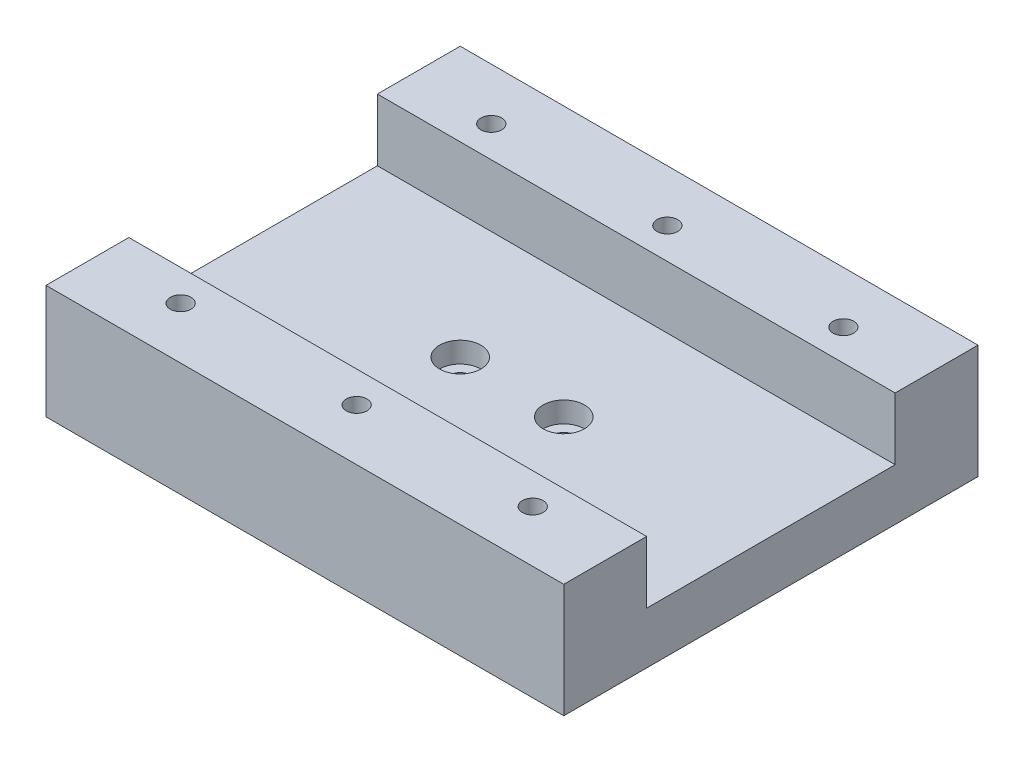
ISO-10303-21;
HEADER;
FILE_DESCRIPTION(('STEP AP214'),'2;1');
FILE_NAME('part.step','',(''),(''),'','','');
FILE_SCHEMA(('AUTOMOTIVE_DESIGN { 1 0 10303 214 1 1 1 1 }'));
ENDSEC;
DATA;
#1=APPLICATION_CONTEXT('core data for automotive mechanical design processes');
#2=APPLICATION_PROTOCOL_DEFINITION('international standard','automotive_design',2000,#1);
#3=PRODUCT_CONTEXT('',#1,'mechanical');
#4=PRODUCT('Part','Part','',(#3));
#5=PRODUCT_RELATED_PRODUCT_CATEGORY('part','',(#4));
#6=PRODUCT_DEFINITION_FORMATION('','',#4);
#7=PRODUCT_DEFINITION_CONTEXT('part definition',#1,'design');
#8=PRODUCT_DEFINITION('design','',#6,#7);
#9=PRODUCT_DEFINITION_SHAPE('','',#8);
#10=(LENGTH_UNIT() NAMED_UNIT(*) SI_UNIT(.MILLI.,.METRE.));
#11=(NAMED_UNIT(*) PLANE_ANGLE_UNIT() SI_UNIT($,.RADIAN.));
#12=(NAMED_UNIT(*) SI_UNIT($,.STERADIAN.) SOLID_ANGLE_UNIT());
#13=UNCERTAINTY_MEASURE_WITH_UNIT(LENGTH_MEASURE(1.E-05),#10,'distance_accuracy_value','');
#14=(GEOMETRIC_REPRESENTATION_CONTEXT(3) GLOBAL_UNCERTAINTY_ASSIGNED_CONTEXT((#13)) GLOBAL_UNIT_ASSIGNED_CONTEXT((#10,
#11,#12)) REPRESENTATION_CONTEXT('',''));
#15=CARTESIAN_POINT('',(0.,0.,0.));
#16=DIRECTION('',(0.,0.,1.));
#17=DIRECTION('',(1.,0.,0.));
#18=AXIS2_PLACEMENT_3D('',#15,#16,#17);
#19=CARTESIAN_POINT('',(0.,5.,0.));
#20=DIRECTION('',(0.,1.,0.));
#21=DIRECTION('',(0.,0.,1.));
#22=AXIS2_PLACEMENT_3D('',#19,#20,#21);
#23=PLANE('',#22);
#24=CARTESIAN_POINT('',(-5.,5.,0.));
#25=DIRECTION('',(0.,1.,0.));
#26=DIRECTION('',(0.,0.,1.));
#27=AXIS2_PLACEMENT_3D('',#24,#25,#26);
#28=CIRCLE('',#27,2.);
#29=CARTESIAN_POINT('',(-5.,5.,2.));
#30=VERTEX_POINT('',#29);
#31=EDGE_CURVE('E155',#30,#30,#28,.T.);
#32=ORIENTED_EDGE('',*,*,#31,.F.);
#33=EDGE_LOOP('',(#32));
#34=FACE_BOUND('',#33,.T.);
#35=CARTESIAN_POINT('',(5.,5.,0.));
#36=DIRECTION('',(0.,1.,0.));
#37=DIRECTION('',(0.,0.,1.));
#38=AXIS2_PLACEMENT_3D('',#35,#36,#37);
#39=CIRCLE('',#38,2.);
#40=CARTESIAN_POINT('',(5.,5.,2.));
#41=VERTEX_POINT('',#40);
#42=EDGE_CURVE('E160',#41,#41,#39,.T.);
#43=ORIENTED_EDGE('',*,*,#42,.F.);
#44=EDGE_LOOP('',(#43));
#45=FACE_BOUND('',#44,.T.);
#46=DIRECTION('',(0.,0.,1.));
#47=VECTOR('',#46,1.);
#48=CARTESIAN_POINT('',(-25.,5.,-20.));
#49=LINE('',#48,#47);
#50=CARTESIAN_POINT('',(-25.,5.,-12.));
#51=VERTEX_POINT('',#50);
#52=CARTESIAN_POINT('',(-25.,5.,12.));
#53=VERTEX_POINT('',#52);
#54=EDGE_CURVE('E120',#51,#53,#49,.T.);
#55=ORIENTED_EDGE('',*,*,#54,.T.);
#56=DIRECTION('',(-1.,0.,0.));
#57=VECTOR('',#56,1.);
#58=CARTESIAN_POINT('',(-25.,5.,12.));
#59=LINE('',#58,#57);
#60=CARTESIAN_POINT('',(25.,5.,12.));
#61=VERTEX_POINT('',#60);
#62=EDGE_CURVE('E109',#61,#53,#59,.T.);
#63=ORIENTED_EDGE('',*,*,#62,.F.);
#64=DIRECTION('',(0.,0.,-1.));
#65=VECTOR('',#64,1.);
#66=CARTESIAN_POINT('',(25.,5.,-20.));
#67=LINE('',#66,#65);
#68=CARTESIAN_POINT('',(25.,5.,-12.));
#69=VERTEX_POINT('',#68);
#70=EDGE_CURVE('E126',#61,#69,#67,.T.);
#71=ORIENTED_EDGE('',*,*,#70,.T.);
#72=DIRECTION('',(1.,0.,0.));
#73=VECTOR('',#72,1.);
#74=CARTESIAN_POINT('',(-25.,5.,-12.));
#75=LINE('',#74,#73);
#76=EDGE_CURVE('E67',#51,#69,#75,.T.);
#77=ORIENTED_EDGE('',*,*,#76,.F.);
#78=EDGE_LOOP('',(#55,#63,#71,#77));
#79=FACE_BOUND('',#78,.T.);
#80=ADVANCED_FACE('F42',(#34,#45,#79),#23,.T.);
#81=CARTESIAN_POINT('',(5.,0.,0.));
#82=DIRECTION('',(0.,1.,0.));
#83=DIRECTION('',(0.,0.,1.));
#84=AXIS2_PLACEMENT_3D('',#81,#82,#83);
#85=CYLINDRICAL_SURFACE('',#84,1.);
#86=CARTESIAN_POINT('',(5.,0.,0.));
#87=DIRECTION('',(0.,1.,0.));
#88=DIRECTION('',(0.,0.,1.));
#89=AXIS2_PLACEMENT_3D('',#86,#87,#88);
#90=CIRCLE('',#89,1.);
#91=CARTESIAN_POINT('',(5.,0.,0.999999999999998));
#92=VERTEX_POINT('',#91);
#93=EDGE_CURVE('E153',#92,#92,#90,.T.);
#94=ORIENTED_EDGE('',*,*,#93,.F.);
#95=EDGE_LOOP('',(#94));
#96=FACE_BOUND('',#95,.T.);
#97=CARTESIAN_POINT('',(5.,3.,0.));
#98=DIRECTION('',(0.,1.,0.));
#99=DIRECTION('',(0.,0.,1.));
#100=AXIS2_PLACEMENT_3D('',#97,#98,#99);
#101=CIRCLE('',#100,1.);
#102=CARTESIAN_POINT('',(5.,3.,0.999999999999998));
#103=VERTEX_POINT('',#102);
#104=EDGE_CURVE('E46',#103,#103,#101,.F.);
#105=ORIENTED_EDGE('',*,*,#104,.F.);
#106=EDGE_LOOP('',(#105));
#107=FACE_BOUND('',#106,.T.);
#108=ADVANCED_FACE('F178',(#96,#107),#85,.F.);
#109=CARTESIAN_POINT('',(-5.,0.,0.));
#110=DIRECTION('',(0.,1.,0.));
#111=DIRECTION('',(0.,0.,1.));
#112=AXIS2_PLACEMENT_3D('',#109,#110,#111);
#113=CYLINDRICAL_SURFACE('',#112,1.);
#114=CARTESIAN_POINT('',(-5.,0.,0.));
#115=DIRECTION('',(0.,1.,0.));
#116=DIRECTION('',(0.,0.,1.));
#117=AXIS2_PLACEMENT_3D('',#114,#115,#116);
#118=CIRCLE('',#117,1.);
#119=CARTESIAN_POINT('',(-5.,0.,1.));
#120=VERTEX_POINT('',#119);
#121=EDGE_CURVE('E139',#120,#120,#118,.T.);
#122=ORIENTED_EDGE('',*,*,#121,.F.);
#123=EDGE_LOOP('',(#122));
#124=FACE_BOUND('',#123,.T.);
#125=CARTESIAN_POINT('',(-5.,3.,0.));
#126=DIRECTION('',(0.,1.,0.));
#127=DIRECTION('',(0.,0.,1.));
#128=AXIS2_PLACEMENT_3D('',#125,#126,#127);
#129=CIRCLE('',#128,1.);
#130=CARTESIAN_POINT('',(-5.,3.,1.));
#131=VERTEX_POINT('',#130);
#132=EDGE_CURVE('E147',#131,#131,#129,.F.);
#133=ORIENTED_EDGE('',*,*,#132,.F.);
#134=EDGE_LOOP('',(#133));
#135=FACE_BOUND('',#134,.T.);
#136=ADVANCED_FACE('F181',(#124,#135),#113,.F.);
#137=CARTESIAN_POINT('',(25.,5.,-20.));
#138=DIRECTION('',(-1.,0.,0.));
#139=DIRECTION('',(0.,0.,1.));
#140=AXIS2_PLACEMENT_3D('',#137,#138,#139);
#141=PLANE('',#140);
#142=DIRECTION('',(0.,0.,-1.));
#143=VECTOR('',#142,1.);
#144=CARTESIAN_POINT('',(25.,0.,-20.));
#145=LINE('',#144,#143);
#146=CARTESIAN_POINT('',(25.,0.,20.));
#147=VERTEX_POINT('',#146);
#148=CARTESIAN_POINT('',(25.,0.,-20.));
#149=VERTEX_POINT('',#148);
#150=EDGE_CURVE('E135',#147,#149,#145,.T.);
#151=ORIENTED_EDGE('',*,*,#150,.T.);
#152=DIRECTION('',(0.,-1.,0.));
#153=VECTOR('',#152,1.);
#154=CARTESIAN_POINT('',(25.,5.,-20.));
#155=LINE('',#154,#153);
#156=CARTESIAN_POINT('',(25.,11.,-20.));
#157=VERTEX_POINT('',#156);
#158=EDGE_CURVE('E11',#157,#149,#155,.T.);
#159=ORIENTED_EDGE('',*,*,#158,.F.);
#160=DIRECTION('',(0.,0.,-1.));
#161=VECTOR('',#160,1.);
#162=CARTESIAN_POINT('',(25.,11.,-20.));
#163=LINE('',#162,#161);
#164=CARTESIAN_POINT('',(25.,11.,-12.));
#165=VERTEX_POINT('',#164);
#166=EDGE_CURVE('E247',#165,#157,#163,.T.);
#167=ORIENTED_EDGE('',*,*,#166,.F.);
#168=DIRECTION('',(0.,-1.,0.));
#169=VECTOR('',#168,1.);
#170=CARTESIAN_POINT('',(25.,11.,-12.));
#171=LINE('',#170,#169);
#172=EDGE_CURVE('E252',#165,#69,#171,.T.);
#173=ORIENTED_EDGE('',*,*,#172,.T.);
#174=ORIENTED_EDGE('',*,*,#70,.F.);
#175=DIRECTION('',(0.,-1.,0.));
#176=VECTOR('',#175,1.);
#177=CARTESIAN_POINT('',(25.,11.,12.));
#178=LINE('',#177,#176);
#179=CARTESIAN_POINT('',(25.,11.,12.));
#180=VERTEX_POINT('',#179);
#181=EDGE_CURVE('E59',#180,#61,#178,.T.);
#182=ORIENTED_EDGE('',*,*,#181,.F.);
#183=DIRECTION('',(0.,0.,-1.));
#184=VECTOR('',#183,1.);
#185=CARTESIAN_POINT('',(25.,11.,20.));
#186=LINE('',#185,#184);
#187=CARTESIAN_POINT('',(25.,11.,20.));
#188=VERTEX_POINT('',#187);
#189=EDGE_CURVE('E236',#188,#180,#186,.T.);
#190=ORIENTED_EDGE('',*,*,#189,.F.);
#191=DIRECTION('',(0.,-1.,0.));
#192=VECTOR('',#191,1.);
#193=CARTESIAN_POINT('',(25.,5.,20.));
#194=LINE('',#193,#192);
#195=EDGE_CURVE('E125',#188,#147,#194,.T.);
#196=ORIENTED_EDGE('',*,*,#195,.T.);
#197=EDGE_LOOP('',(#151,#159,#167,#173,#174,#182,#190,#196));
#198=FACE_BOUND('',#197,.T.);
#199=ADVANCED_FACE('F44',(#198),#141,.F.);
#200=CARTESIAN_POINT('',(-25.,5.,-20.));
#201=DIRECTION('',(0.,0.,1.));
#202=DIRECTION('',(1.,0.,0.));
#203=AXIS2_PLACEMENT_3D('',#200,#201,#202);
#204=PLANE('',#203);
#205=DIRECTION('',(-1.,0.,0.));
#206=VECTOR('',#205,1.);
#207=CARTESIAN_POINT('',(-25.,0.,-20.));
#208=LINE('',#207,#206);
#209=CARTESIAN_POINT('',(-25.,0.,-20.));
#210=VERTEX_POINT('',#209);
#211=EDGE_CURVE('E138',#149,#210,#208,.T.);
#212=ORIENTED_EDGE('',*,*,#211,.T.);
#213=DIRECTION('',(0.,-1.,0.));
#214=VECTOR('',#213,1.);
#215=CARTESIAN_POINT('',(-25.,5.,-20.));
#216=LINE('',#215,#214);
#217=CARTESIAN_POINT('',(-25.,11.,-20.));
#218=VERTEX_POINT('',#217);
#219=EDGE_CURVE('E51',#218,#210,#216,.T.);
#220=ORIENTED_EDGE('',*,*,#219,.F.);
#221=DIRECTION('',(-1.,0.,0.));
#222=VECTOR('',#221,1.);
#223=CARTESIAN_POINT('',(-25.,11.,-20.));
#224=LINE('',#223,#222);
#225=EDGE_CURVE('E250',#157,#218,#224,.T.);
#226=ORIENTED_EDGE('',*,*,#225,.F.);
#227=ORIENTED_EDGE('',*,*,#158,.T.);
#228=EDGE_LOOP('',(#212,#220,#226,#227));
#229=FACE_BOUND('',#228,.T.);
#230=ADVANCED_FACE('F218',(#229),#204,.F.);
#231=CARTESIAN_POINT('',(-25.,5.,-20.));
#232=DIRECTION('',(1.,0.,0.));
#233=DIRECTION('',(0.,0.,-1.));
#234=AXIS2_PLACEMENT_3D('',#231,#232,#233);
#235=PLANE('',#234);
#236=DIRECTION('',(0.,0.,1.));
#237=VECTOR('',#236,1.);
#238=CARTESIAN_POINT('',(-25.,0.,-20.));
#239=LINE('',#238,#237);
#240=CARTESIAN_POINT('',(-25.,0.,20.));
#241=VERTEX_POINT('',#240);
#242=EDGE_CURVE('E141',#210,#241,#239,.T.);
#243=ORIENTED_EDGE('',*,*,#242,.T.);
#244=DIRECTION('',(0.,-1.,0.));
#245=VECTOR('',#244,1.);
#246=CARTESIAN_POINT('',(-25.,5.,20.));
#247=LINE('',#246,#245);
#248=CARTESIAN_POINT('',(-25.,11.,20.));
#249=VERTEX_POINT('',#248);
#250=EDGE_CURVE('E129',#249,#241,#247,.T.);
#251=ORIENTED_EDGE('',*,*,#250,.F.);
#252=DIRECTION('',(0.,0.,1.));
#253=VECTOR('',#252,1.);
#254=CARTESIAN_POINT('',(-25.,11.,20.));
#255=LINE('',#254,#253);
#256=CARTESIAN_POINT('',(-25.,11.,12.));
#257=VERTEX_POINT('',#256);
#258=EDGE_CURVE('E115',#257,#249,#255,.T.);
#259=ORIENTED_EDGE('',*,*,#258,.F.);
#260=DIRECTION('',(0.,-1.,0.));
#261=VECTOR('',#260,1.);
#262=CARTESIAN_POINT('',(-25.,11.,12.));
#263=LINE('',#262,#261);
#264=EDGE_CURVE('E112',#257,#53,#263,.T.);
#265=ORIENTED_EDGE('',*,*,#264,.T.);
#266=ORIENTED_EDGE('',*,*,#54,.F.);
#267=DIRECTION('',(0.,-1.,0.));
#268=VECTOR('',#267,1.);
#269=CARTESIAN_POINT('',(-25.,11.,-12.));
#270=LINE('',#269,#268);
#271=CARTESIAN_POINT('',(-25.,11.,-12.));
#272=VERTEX_POINT('',#271);
#273=EDGE_CURVE('E163',#272,#51,#270,.T.);
#274=ORIENTED_EDGE('',*,*,#273,.F.);
#275=DIRECTION('',(0.,0.,1.));
#276=VECTOR('',#275,1.);
#277=CARTESIAN_POINT('',(-25.,11.,-20.));
#278=LINE('',#277,#276);
#279=EDGE_CURVE('E231',#218,#272,#278,.T.);
#280=ORIENTED_EDGE('',*,*,#279,.F.);
#281=ORIENTED_EDGE('',*,*,#219,.T.);
#282=EDGE_LOOP('',(#243,#251,#259,#265,#266,#274,#280,#281));
#283=FACE_BOUND('',#282,.T.);
#284=ADVANCED_FACE('F118',(#283),#235,.F.);
#285=CARTESIAN_POINT('',(-25.,5.,20.));
#286=DIRECTION('',(0.,0.,-1.));
#287=DIRECTION('',(-1.,0.,0.));
#288=AXIS2_PLACEMENT_3D('',#285,#286,#287);
#289=PLANE('',#288);
#290=DIRECTION('',(1.,0.,0.));
#291=VECTOR('',#290,1.);
#292=CARTESIAN_POINT('',(-25.,0.,20.));
#293=LINE('',#292,#291);
#294=EDGE_CURVE('E131',#241,#147,#293,.T.);
#295=ORIENTED_EDGE('',*,*,#294,.T.);
#296=ORIENTED_EDGE('',*,*,#195,.F.);
#297=DIRECTION('',(1.,0.,0.));
#298=VECTOR('',#297,1.);
#299=CARTESIAN_POINT('',(-25.,11.,20.));
#300=LINE('',#299,#298);
#301=EDGE_CURVE('E238',#249,#188,#300,.T.);
#302=ORIENTED_EDGE('',*,*,#301,.F.);
#303=ORIENTED_EDGE('',*,*,#250,.T.);
#304=EDGE_LOOP('',(#295,#296,#302,#303));
#305=FACE_BOUND('',#304,.T.);
#306=ADVANCED_FACE('F212',(#305),#289,.F.);
#307=CARTESIAN_POINT('',(0.,0.,0.));
#308=DIRECTION('',(0.,1.,0.));
#309=DIRECTION('',(0.,0.,1.));
#310=AXIS2_PLACEMENT_3D('',#307,#308,#309);
#311=PLANE('',#310);
#312=CARTESIAN_POINT('',(0.,0.,-15.));
#313=DIRECTION('',(0.,1.,0.));
#314=DIRECTION('',(0.,0.,1.));
#315=AXIS2_PLACEMENT_3D('',#312,#313,#314);
#316=CIRCLE('',#315,1.);
#317=CARTESIAN_POINT('',(0.,0.,-14.));
#318=VERTEX_POINT('',#317);
#319=EDGE_CURVE('E444',#318,#318,#316,.T.);
#320=ORIENTED_EDGE('',*,*,#319,.T.);
#321=EDGE_LOOP('',(#320));
#322=FACE_BOUND('',#321,.T.);
#323=CARTESIAN_POINT('',(17.,0.,-15.));
#324=DIRECTION('',(0.,1.,0.));
#325=DIRECTION('',(0.,0.,1.));
#326=AXIS2_PLACEMENT_3D('',#323,#324,#325);
#327=CIRCLE('',#326,1.);
#328=CARTESIAN_POINT('',(17.,0.,-14.));
#329=VERTEX_POINT('',#328);
#330=EDGE_CURVE('E456',#329,#329,#327,.T.);
#331=ORIENTED_EDGE('',*,*,#330,.T.);
#332=EDGE_LOOP('',(#331));
#333=FACE_BOUND('',#332,.T.);
#334=CARTESIAN_POINT('',(-17.,0.,15.));
#335=DIRECTION('',(0.,1.,0.));
#336=DIRECTION('',(0.,0.,1.));
#337=AXIS2_PLACEMENT_3D('',#334,#335,#336);
#338=CIRCLE('',#337,1.);
#339=CARTESIAN_POINT('',(-17.,0.,16.));
#340=VERTEX_POINT('',#339);
#341=EDGE_CURVE('E462',#340,#340,#338,.T.);
#342=ORIENTED_EDGE('',*,*,#341,.T.);
#343=EDGE_LOOP('',(#342));
#344=FACE_BOUND('',#343,.T.);
#345=CARTESIAN_POINT('',(0.,0.,15.));
#346=DIRECTION('',(0.,1.,0.));
#347=DIRECTION('',(0.,0.,1.));
#348=AXIS2_PLACEMENT_3D('',#345,#346,#347);
#349=CIRCLE('',#348,1.);
#350=CARTESIAN_POINT('',(0.,0.,16.));
#351=VERTEX_POINT('',#350);
#352=EDGE_CURVE('E468',#351,#351,#349,.T.);
#353=ORIENTED_EDGE('',*,*,#352,.T.);
#354=EDGE_LOOP('',(#353));
#355=FACE_BOUND('',#354,.T.);
#356=CARTESIAN_POINT('',(17.,0.,15.));
#357=DIRECTION('',(0.,1.,0.));
#358=DIRECTION('',(0.,0.,1.));
#359=AXIS2_PLACEMENT_3D('',#356,#357,#358);
#360=CIRCLE('',#359,1.);
#361=CARTESIAN_POINT('',(17.,0.,16.));
#362=VERTEX_POINT('',#361);
#363=EDGE_CURVE('E538',#362,#362,#360,.T.);
#364=ORIENTED_EDGE('',*,*,#363,.T.);
#365=EDGE_LOOP('',(#364));
#366=FACE_BOUND('',#365,.T.);
#367=CARTESIAN_POINT('',(-17.,0.,-15.));
#368=DIRECTION('',(0.,1.,0.));
#369=DIRECTION('',(0.,0.,1.));
#370=AXIS2_PLACEMENT_3D('',#367,#368,#369);
#371=CIRCLE('',#370,1.);
#372=CARTESIAN_POINT('',(-17.,0.,-14.));
#373=VERTEX_POINT('',#372);
#374=EDGE_CURVE('E450',#373,#373,#371,.T.);
#375=ORIENTED_EDGE('',*,*,#374,.T.);
#376=EDGE_LOOP('',(#375));
#377=FACE_BOUND('',#376,.T.);
#378=ORIENTED_EDGE('',*,*,#121,.T.);
#379=EDGE_LOOP('',(#378));
#380=FACE_BOUND('',#379,.T.);
#381=ORIENTED_EDGE('',*,*,#93,.T.);
#382=EDGE_LOOP('',(#381));
#383=FACE_BOUND('',#382,.T.);
#384=ORIENTED_EDGE('',*,*,#150,.F.);
#385=ORIENTED_EDGE('',*,*,#294,.F.);
#386=ORIENTED_EDGE('',*,*,#242,.F.);
#387=ORIENTED_EDGE('',*,*,#211,.F.);
#388=EDGE_LOOP('',(#384,#385,#386,#387));
#389=FACE_BOUND('',#388,.T.);
#390=ADVANCED_FACE('F175',(#322,#333,#344,#355,#366,#377,#380,#383,#389),#311,.F.);
#391=CARTESIAN_POINT('',(-5.,3.,0.));
#392=DIRECTION('',(0.,1.,0.));
#393=DIRECTION('',(0.,0.,1.));
#394=AXIS2_PLACEMENT_3D('',#391,#392,#393);
#395=PLANE('',#394);
#396=CARTESIAN_POINT('',(-5.,3.,0.));
#397=DIRECTION('',(0.,1.,0.));
#398=DIRECTION('',(0.,0.,1.));
#399=AXIS2_PLACEMENT_3D('',#396,#397,#398);
#400=CIRCLE('',#399,2.);
#401=CARTESIAN_POINT('',(-5.,3.,2.));
#402=VERTEX_POINT('',#401);
#403=EDGE_CURVE('E149',#402,#402,#400,.T.);
#404=ORIENTED_EDGE('',*,*,#403,.T.);
#405=EDGE_LOOP('',(#404));
#406=FACE_BOUND('',#405,.T.);
#407=ORIENTED_EDGE('',*,*,#132,.T.);
#408=EDGE_LOOP('',(#407));
#409=FACE_BOUND('',#408,.T.);
#410=ADVANCED_FACE('F198',(#406,#409),#395,.T.);
#411=CARTESIAN_POINT('',(-5.,3.,0.));
#412=DIRECTION('',(0.,1.,0.));
#413=DIRECTION('',(0.,0.,1.));
#414=AXIS2_PLACEMENT_3D('',#411,#412,#413);
#415=CYLINDRICAL_SURFACE('',#414,2.);
#416=ORIENTED_EDGE('',*,*,#403,.F.);
#417=EDGE_LOOP('',(#416));
#418=FACE_BOUND('',#417,.T.);
#419=ORIENTED_EDGE('',*,*,#31,.T.);
#420=EDGE_LOOP('',(#419));
#421=FACE_BOUND('',#420,.T.);
#422=ADVANCED_FACE('F188',(#418,#421),#415,.F.);
#423=CARTESIAN_POINT('',(5.,3.,0.));
#424=DIRECTION('',(0.,1.,0.));
#425=DIRECTION('',(0.,0.,1.));
#426=AXIS2_PLACEMENT_3D('',#423,#424,#425);
#427=PLANE('',#426);
#428=CARTESIAN_POINT('',(5.,3.,0.));
#429=DIRECTION('',(0.,1.,0.));
#430=DIRECTION('',(0.,0.,1.));
#431=AXIS2_PLACEMENT_3D('',#428,#429,#430);
#432=CIRCLE('',#431,2.);
#433=CARTESIAN_POINT('',(5.,3.,2.));
#434=VERTEX_POINT('',#433);
#435=EDGE_CURVE('E168',#434,#434,#432,.T.);
#436=ORIENTED_EDGE('',*,*,#435,.T.);
#437=EDGE_LOOP('',(#436));
#438=FACE_BOUND('',#437,.T.);
#439=ORIENTED_EDGE('',*,*,#104,.T.);
#440=EDGE_LOOP('',(#439));
#441=FACE_BOUND('',#440,.T.);
#442=ADVANCED_FACE('F185',(#438,#441),#427,.T.);
#443=CARTESIAN_POINT('',(5.,3.,0.));
#444=DIRECTION('',(0.,1.,0.));
#445=DIRECTION('',(0.,0.,1.));
#446=AXIS2_PLACEMENT_3D('',#443,#444,#445);
#447=CYLINDRICAL_SURFACE('',#446,2.);
#448=ORIENTED_EDGE('',*,*,#435,.F.);
#449=EDGE_LOOP('',(#448));
#450=FACE_BOUND('',#449,.T.);
#451=ORIENTED_EDGE('',*,*,#42,.T.);
#452=EDGE_LOOP('',(#451));
#453=FACE_BOUND('',#452,.T.);
#454=ADVANCED_FACE('F187',(#450,#453),#447,.F.);
#455=CARTESIAN_POINT('',(-25.,11.,-12.));
#456=DIRECTION('',(0.,0.,-1.));
#457=DIRECTION('',(-1.,0.,0.));
#458=AXIS2_PLACEMENT_3D('',#455,#456,#457);
#459=PLANE('',#458);
#460=ORIENTED_EDGE('',*,*,#76,.T.);
#461=ORIENTED_EDGE('',*,*,#172,.F.);
#462=DIRECTION('',(1.,0.,0.));
#463=VECTOR('',#462,1.);
#464=CARTESIAN_POINT('',(-25.,11.,-12.));
#465=LINE('',#464,#463);
#466=EDGE_CURVE('E245',#272,#165,#465,.T.);
#467=ORIENTED_EDGE('',*,*,#466,.F.);
#468=ORIENTED_EDGE('',*,*,#273,.T.);
#469=EDGE_LOOP('',(#460,#461,#467,#468));
#470=FACE_BOUND('',#469,.T.);
#471=ADVANCED_FACE('F195',(#470),#459,.F.);
#472=CARTESIAN_POINT('',(0.,11.,0.));
#473=DIRECTION('',(0.,1.,0.));
#474=DIRECTION('',(0.,0.,1.));
#475=AXIS2_PLACEMENT_3D('',#472,#473,#474);
#476=PLANE('',#475);
#477=CARTESIAN_POINT('',(0.,11.,-15.));
#478=DIRECTION('',(0.,1.,0.));
#479=DIRECTION('',(0.,0.,1.));
#480=AXIS2_PLACEMENT_3D('',#477,#478,#479);
#481=CIRCLE('',#480,1.);
#482=CARTESIAN_POINT('',(0.,11.,-14.));
#483=VERTEX_POINT('',#482);
#484=EDGE_CURVE('E446',#483,#483,#481,.T.);
#485=ORIENTED_EDGE('',*,*,#484,.F.);
#486=EDGE_LOOP('',(#485));
#487=FACE_BOUND('',#486,.T.);
#488=CARTESIAN_POINT('',(17.,11.,-15.));
#489=DIRECTION('',(0.,1.,0.));
#490=DIRECTION('',(0.,0.,1.));
#491=AXIS2_PLACEMENT_3D('',#488,#489,#490);
#492=CIRCLE('',#491,1.);
#493=CARTESIAN_POINT('',(17.,11.,-14.));
#494=VERTEX_POINT('',#493);
#495=EDGE_CURVE('E452',#494,#494,#492,.T.);
#496=ORIENTED_EDGE('',*,*,#495,.F.);
#497=EDGE_LOOP('',(#496));
#498=FACE_BOUND('',#497,.T.);
#499=CARTESIAN_POINT('',(-17.,11.,-15.));
#500=DIRECTION('',(0.,1.,0.));
#501=DIRECTION('',(0.,0.,1.));
#502=AXIS2_PLACEMENT_3D('',#499,#500,#501);
#503=CIRCLE('',#502,1.);
#504=CARTESIAN_POINT('',(-17.,11.,-14.));
#505=VERTEX_POINT('',#504);
#506=EDGE_CURVE('E447',#505,#505,#503,.T.);
#507=ORIENTED_EDGE('',*,*,#506,.F.);
#508=EDGE_LOOP('',(#507));
#509=FACE_BOUND('',#508,.T.);
#510=ORIENTED_EDGE('',*,*,#279,.T.);
#511=ORIENTED_EDGE('',*,*,#466,.T.);
#512=ORIENTED_EDGE('',*,*,#166,.T.);
#513=ORIENTED_EDGE('',*,*,#225,.T.);
#514=EDGE_LOOP('',(#510,#511,#512,#513));
#515=FACE_BOUND('',#514,.T.);
#516=ADVANCED_FACE('F258',(#487,#498,#509,#515),#476,.T.);
#517=CARTESIAN_POINT('',(-25.,11.,12.));
#518=DIRECTION('',(0.,0.,1.));
#519=DIRECTION('',(1.,0.,0.));
#520=AXIS2_PLACEMENT_3D('',#517,#518,#519);
#521=PLANE('',#520);
#522=ORIENTED_EDGE('',*,*,#62,.T.);
#523=ORIENTED_EDGE('',*,*,#264,.F.);
#524=DIRECTION('',(-1.,0.,0.));
#525=VECTOR('',#524,1.);
#526=CARTESIAN_POINT('',(-25.,11.,12.));
#527=LINE('',#526,#525);
#528=EDGE_CURVE('E123',#180,#257,#527,.T.);
#529=ORIENTED_EDGE('',*,*,#528,.F.);
#530=ORIENTED_EDGE('',*,*,#181,.T.);
#531=EDGE_LOOP('',(#522,#523,#529,#530));
#532=FACE_BOUND('',#531,.T.);
#533=ADVANCED_FACE('F111',(#532),#521,.F.);
#534=CARTESIAN_POINT('',(0.,11.,0.));
#535=DIRECTION('',(0.,-1.,0.));
#536=DIRECTION('',(0.,0.,-1.));
#537=AXIS2_PLACEMENT_3D('',#534,#535,#536);
#538=PLANE('',#537);
#539=CARTESIAN_POINT('',(-17.,11.,15.));
#540=DIRECTION('',(0.,1.,0.));
#541=DIRECTION('',(0.,0.,1.));
#542=AXIS2_PLACEMENT_3D('',#539,#540,#541);
#543=CIRCLE('',#542,1.);
#544=CARTESIAN_POINT('',(-17.,11.,16.));
#545=VERTEX_POINT('',#544);
#546=EDGE_CURVE('E459',#545,#545,#543,.T.);
#547=ORIENTED_EDGE('',*,*,#546,.F.);
#548=EDGE_LOOP('',(#547));
#549=FACE_BOUND('',#548,.T.);
#550=CARTESIAN_POINT('',(0.,11.,15.));
#551=DIRECTION('',(0.,1.,0.));
#552=DIRECTION('',(0.,0.,1.));
#553=AXIS2_PLACEMENT_3D('',#550,#551,#552);
#554=CIRCLE('',#553,1.);
#555=CARTESIAN_POINT('',(0.,11.,16.));
#556=VERTEX_POINT('',#555);
#557=EDGE_CURVE('E465',#556,#556,#554,.T.);
#558=ORIENTED_EDGE('',*,*,#557,.F.);
#559=EDGE_LOOP('',(#558));
#560=FACE_BOUND('',#559,.T.);
#561=CARTESIAN_POINT('',(17.,11.,15.));
#562=DIRECTION('',(0.,1.,0.));
#563=DIRECTION('',(0.,0.,1.));
#564=AXIS2_PLACEMENT_3D('',#561,#562,#563);
#565=CIRCLE('',#564,1.);
#566=CARTESIAN_POINT('',(17.,11.,16.));
#567=VERTEX_POINT('',#566);
#568=EDGE_CURVE('E471',#567,#567,#565,.T.);
#569=ORIENTED_EDGE('',*,*,#568,.F.);
#570=EDGE_LOOP('',(#569));
#571=FACE_BOUND('',#570,.T.);
#572=ORIENTED_EDGE('',*,*,#258,.T.);
#573=ORIENTED_EDGE('',*,*,#301,.T.);
#574=ORIENTED_EDGE('',*,*,#189,.T.);
#575=ORIENTED_EDGE('',*,*,#528,.T.);
#576=EDGE_LOOP('',(#572,#573,#574,#575));
#577=FACE_BOUND('',#576,.T.);
#578=ADVANCED_FACE('F266',(#549,#560,#571,#577),#538,.F.);
#579=CARTESIAN_POINT('',(17.,0.,15.));
#580=DIRECTION('',(0.,1.,0.));
#581=DIRECTION('',(0.,0.,1.));
#582=AXIS2_PLACEMENT_3D('',#579,#580,#581);
#583=CYLINDRICAL_SURFACE('',#582,1.);
#584=ORIENTED_EDGE('',*,*,#363,.F.);
#585=EDGE_LOOP('',(#584));
#586=FACE_BOUND('',#585,.T.);
#587=ORIENTED_EDGE('',*,*,#568,.T.);
#588=EDGE_LOOP('',(#587));
#589=FACE_BOUND('',#588,.T.);
#590=ADVANCED_FACE('F361',(#586,#589),#583,.F.);
#591=CARTESIAN_POINT('',(0.,0.,15.));
#592=DIRECTION('',(0.,1.,0.));
#593=DIRECTION('',(0.,0.,1.));
#594=AXIS2_PLACEMENT_3D('',#591,#592,#593);
#595=CYLINDRICAL_SURFACE('',#594,1.);
#596=ORIENTED_EDGE('',*,*,#352,.F.);
#597=EDGE_LOOP('',(#596));
#598=FACE_BOUND('',#597,.T.);
#599=ORIENTED_EDGE('',*,*,#557,.T.);
#600=EDGE_LOOP('',(#599));
#601=FACE_BOUND('',#600,.T.);
#602=ADVANCED_FACE('F371',(#598,#601),#595,.F.);
#603=CARTESIAN_POINT('',(-17.,0.,15.));
#604=DIRECTION('',(0.,1.,0.));
#605=DIRECTION('',(0.,0.,1.));
#606=AXIS2_PLACEMENT_3D('',#603,#604,#605);
#607=CYLINDRICAL_SURFACE('',#606,1.);
#608=ORIENTED_EDGE('',*,*,#341,.F.);
#609=EDGE_LOOP('',(#608));
#610=FACE_BOUND('',#609,.T.);
#611=ORIENTED_EDGE('',*,*,#546,.T.);
#612=EDGE_LOOP('',(#611));
#613=FACE_BOUND('',#612,.T.);
#614=ADVANCED_FACE('F382',(#610,#613),#607,.F.);
#615=CARTESIAN_POINT('',(-17.,0.,-15.));
#616=DIRECTION('',(0.,1.,0.));
#617=DIRECTION('',(0.,0.,1.));
#618=AXIS2_PLACEMENT_3D('',#615,#616,#617);
#619=CYLINDRICAL_SURFACE('',#618,1.);
#620=ORIENTED_EDGE('',*,*,#374,.F.);
#621=EDGE_LOOP('',(#620));
#622=FACE_BOUND('',#621,.T.);
#623=ORIENTED_EDGE('',*,*,#506,.T.);
#624=EDGE_LOOP('',(#623));
#625=FACE_BOUND('',#624,.T.);
#626=ADVANCED_FACE('F393',(#622,#625),#619,.F.);
#627=CARTESIAN_POINT('',(17.,0.,-15.));
#628=DIRECTION('',(0.,1.,0.));
#629=DIRECTION('',(0.,0.,1.));
#630=AXIS2_PLACEMENT_3D('',#627,#628,#629);
#631=CYLINDRICAL_SURFACE('',#630,1.);
#632=ORIENTED_EDGE('',*,*,#330,.F.);
#633=EDGE_LOOP('',(#632));
#634=FACE_BOUND('',#633,.T.);
#635=ORIENTED_EDGE('',*,*,#495,.T.);
#636=EDGE_LOOP('',(#635));
#637=FACE_BOUND('',#636,.T.);
#638=ADVANCED_FACE('F404',(#634,#637),#631,.F.);
#639=CARTESIAN_POINT('',(0.,0.,-15.));
#640=DIRECTION('',(0.,1.,0.));
#641=DIRECTION('',(0.,0.,1.));
#642=AXIS2_PLACEMENT_3D('',#639,#640,#641);
#643=CYLINDRICAL_SURFACE('',#642,1.);
#644=ORIENTED_EDGE('',*,*,#319,.F.);
#645=EDGE_LOOP('',(#644));
#646=FACE_BOUND('',#645,.T.);
#647=ORIENTED_EDGE('',*,*,#484,.T.);
#648=EDGE_LOOP('',(#647));
#649=FACE_BOUND('',#648,.T.);
#650=ADVANCED_FACE('F415',(#646,#649),#643,.F.);
#651=CLOSED_SHELL('',(#80,#108,#136,#199,#230,#284,#306,#390,#410,#422,#442,#454,#471,#516,#533,
#578,#590,#602,#614,#626,#638,#650));
#652=MANIFOLD_SOLID_BREP('B2',#651);
#653=ADVANCED_BREP_SHAPE_REPRESENTATION('',(#18,#652),#14);
#654=SHAPE_DEFINITION_REPRESENTATION(#9,#653);
ENDSEC;
END-ISO-10303-21;
